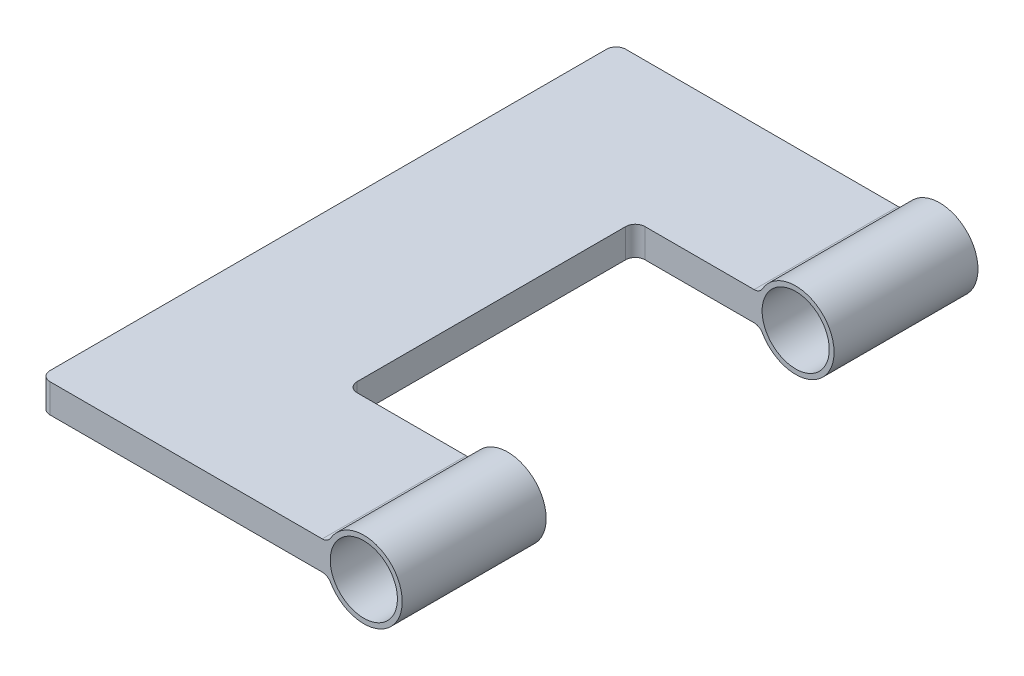
ISO-10303-21;
HEADER;
FILE_DESCRIPTION(('STEP AP214'),'2;1');
FILE_NAME('part.step','',(''),(''),'','','');
FILE_SCHEMA(('AUTOMOTIVE_DESIGN { 1 0 10303 214 1 1 1 1 }'));
ENDSEC;
DATA;
#1=APPLICATION_CONTEXT('core data for automotive mechanical design processes');
#2=APPLICATION_PROTOCOL_DEFINITION('international standard','automotive_design',2000,#1);
#3=PRODUCT_CONTEXT('',#1,'mechanical');
#4=PRODUCT('Part','Part','',(#3));
#5=PRODUCT_RELATED_PRODUCT_CATEGORY('part','',(#4));
#6=PRODUCT_DEFINITION_FORMATION('','',#4);
#7=PRODUCT_DEFINITION_CONTEXT('part definition',#1,'design');
#8=PRODUCT_DEFINITION('design','',#6,#7);
#9=PRODUCT_DEFINITION_SHAPE('','',#8);
#10=(LENGTH_UNIT() NAMED_UNIT(*) SI_UNIT(.MILLI.,.METRE.));
#11=(NAMED_UNIT(*) PLANE_ANGLE_UNIT() SI_UNIT($,.RADIAN.));
#12=(NAMED_UNIT(*) SI_UNIT($,.STERADIAN.) SOLID_ANGLE_UNIT());
#13=UNCERTAINTY_MEASURE_WITH_UNIT(LENGTH_MEASURE(1.E-05),#10,'distance_accuracy_value','');
#14=(GEOMETRIC_REPRESENTATION_CONTEXT(3) GLOBAL_UNCERTAINTY_ASSIGNED_CONTEXT((#13)) GLOBAL_UNIT_ASSIGNED_CONTEXT((#10,
#11,#12)) REPRESENTATION_CONTEXT('',''));
#15=CARTESIAN_POINT('',(0.,0.,0.));
#16=DIRECTION('',(0.,0.,1.));
#17=DIRECTION('',(1.,0.,0.));
#18=AXIS2_PLACEMENT_3D('',#15,#16,#17);
#19=CARTESIAN_POINT('',(168.540496217739,7.5,150.));
#20=DIRECTION('',(0.,0.,-1.));
#21=DIRECTION('',(-1.,0.,0.));
#22=AXIS2_PLACEMENT_3D('',#19,#20,#21);
#23=CYLINDRICAL_SURFACE('',#22,20.);
#24=CARTESIAN_POINT('',(168.540496217739,7.5,-75.));
#25=DIRECTION('',(0.,0.,-1.));
#26=DIRECTION('',(-1.,0.,0.));
#27=AXIS2_PLACEMENT_3D('',#24,#25,#26);
#28=CIRCLE('',#27,20.);
#29=CARTESIAN_POINT('',(151.21998814205,17.5,-75.));
#30=VERTEX_POINT('',#29);
#31=CARTESIAN_POINT('',(151.21998814205,-2.49999999999999,-75.));
#32=VERTEX_POINT('',#31);
#33=EDGE_CURVE('E270',#30,#32,#28,.T.);
#34=ORIENTED_EDGE('',*,*,#33,.T.);
#35=DIRECTION('',(0.,0.,-1.));
#36=VECTOR('',#35,1.);
#37=CARTESIAN_POINT('',(151.21998814205,-2.5,150.));
#38=LINE('',#37,#36);
#39=CARTESIAN_POINT('',(151.21998814205,-2.49999999999999,-150.));
#40=VERTEX_POINT('',#39);
#41=EDGE_CURVE('E205',#32,#40,#38,.T.);
#42=ORIENTED_EDGE('',*,*,#41,.T.);
#43=CARTESIAN_POINT('',(168.540496217739,7.5,-150.));
#44=DIRECTION('',(0.,0.,1.));
#45=DIRECTION('',(1.,0.,0.));
#46=AXIS2_PLACEMENT_3D('',#43,#44,#45);
#47=CIRCLE('',#46,20.);
#48=CARTESIAN_POINT('',(151.21998814205,17.5,-150.));
#49=VERTEX_POINT('',#48);
#50=EDGE_CURVE('E268',#40,#49,#47,.T.);
#51=ORIENTED_EDGE('',*,*,#50,.T.);
#52=DIRECTION('',(0.,0.,-1.));
#53=VECTOR('',#52,1.);
#54=CARTESIAN_POINT('',(151.21998814205,17.5,150.));
#55=LINE('',#54,#53);
#56=EDGE_CURVE('E203',#49,#30,#55,.F.);
#57=ORIENTED_EDGE('',*,*,#56,.T.);
#58=EDGE_LOOP('',(#34,#42,#51,#57));
#59=FACE_BOUND('',#58,.T.);
#60=ADVANCED_FACE('F36',(#59),#23,.T.);
#61=CARTESIAN_POINT('',(0.,0.,150.));
#62=DIRECTION('',(1.,0.,0.));
#63=DIRECTION('',(0.,0.,-1.));
#64=AXIS2_PLACEMENT_3D('',#61,#62,#63);
#65=PLANE('',#64);
#66=DIRECTION('',(0.,0.,-1.));
#67=VECTOR('',#66,1.);
#68=CARTESIAN_POINT('',(0.,15.,150.));
#69=LINE('',#68,#67);
#70=CARTESIAN_POINT('',(0.,15.,145.));
#71=VERTEX_POINT('',#70);
#72=CARTESIAN_POINT('',(0.,15.,-145.));
#73=VERTEX_POINT('',#72);
#74=EDGE_CURVE('E173',#71,#73,#69,.T.);
#75=ORIENTED_EDGE('',*,*,#74,.T.);
#76=DIRECTION('',(0.,-1.,0.));
#77=VECTOR('',#76,1.);
#78=CARTESIAN_POINT('',(0.,0.,-145.));
#79=LINE('',#78,#77);
#80=CARTESIAN_POINT('',(0.,0.,-145.));
#81=VERTEX_POINT('',#80);
#82=EDGE_CURVE('E171',#73,#81,#79,.T.);
#83=ORIENTED_EDGE('',*,*,#82,.T.);
#84=DIRECTION('',(0.,0.,-1.));
#85=VECTOR('',#84,1.);
#86=CARTESIAN_POINT('',(0.,0.,150.));
#87=LINE('',#86,#85);
#88=CARTESIAN_POINT('',(0.,0.,145.));
#89=VERTEX_POINT('',#88);
#90=EDGE_CURVE('E154',#89,#81,#87,.T.);
#91=ORIENTED_EDGE('',*,*,#90,.F.);
#92=DIRECTION('',(0.,-1.,0.));
#93=VECTOR('',#92,1.);
#94=CARTESIAN_POINT('',(0.,15.,145.));
#95=LINE('',#94,#93);
#96=EDGE_CURVE('E168',#89,#71,#95,.F.);
#97=ORIENTED_EDGE('',*,*,#96,.T.);
#98=EDGE_LOOP('',(#75,#83,#91,#97));
#99=FACE_BOUND('',#98,.T.);
#100=ADVANCED_FACE('F167',(#99),#65,.F.);
#101=CARTESIAN_POINT('',(0.,0.,150.));
#102=DIRECTION('',(0.,1.,0.));
#103=DIRECTION('',(0.,0.,1.));
#104=AXIS2_PLACEMENT_3D('',#101,#102,#103);
#105=PLANE('',#104);
#106=ORIENTED_EDGE('',*,*,#90,.T.);
#107=CARTESIAN_POINT('',(5.,0.,-145.));
#108=DIRECTION('',(0.,1.,0.));
#109=DIRECTION('',(0.,0.,1.));
#110=AXIS2_PLACEMENT_3D('',#107,#108,#109);
#111=CIRCLE('',#110,5.);
#112=CARTESIAN_POINT('',(5.,0.,-150.));
#113=VERTEX_POINT('',#112);
#114=EDGE_CURVE('E161',#81,#113,#111,.F.);
#115=ORIENTED_EDGE('',*,*,#114,.T.);
#116=DIRECTION('',(1.,0.,0.));
#117=VECTOR('',#116,1.);
#118=CARTESIAN_POINT('',(0.,0.,-150.));
#119=LINE('',#118,#117);
#120=CARTESIAN_POINT('',(146.889861123128,0.,-150.));
#121=VERTEX_POINT('',#120);
#122=EDGE_CURVE('E265',#113,#121,#119,.T.);
#123=ORIENTED_EDGE('',*,*,#122,.T.);
#124=DIRECTION('',(0.,0.,1.));
#125=VECTOR('',#124,1.);
#126=CARTESIAN_POINT('',(146.889861123128,0.,-75.));
#127=LINE('',#126,#125);
#128=CARTESIAN_POINT('',(146.889861123128,0.,-75.));
#129=VERTEX_POINT('',#128);
#130=EDGE_CURVE('E162',#121,#129,#127,.T.);
#131=ORIENTED_EDGE('',*,*,#130,.T.);
#132=DIRECTION('',(-1.,0.,0.));
#133=VECTOR('',#132,1.);
#134=CARTESIAN_POINT('',(0.,0.,-75.));
#135=LINE('',#134,#133);
#136=CARTESIAN_POINT('',(90.,0.,-75.));
#137=VERTEX_POINT('',#136);
#138=EDGE_CURVE('E261',#129,#137,#135,.T.);
#139=ORIENTED_EDGE('',*,*,#138,.T.);
#140=CARTESIAN_POINT('',(90.,0.,-70.));
#141=DIRECTION('',(0.,1.,0.));
#142=DIRECTION('',(0.,0.,1.));
#143=AXIS2_PLACEMENT_3D('',#140,#141,#142);
#144=CIRCLE('',#143,5.);
#145=CARTESIAN_POINT('',(85.,0.,-70.));
#146=VERTEX_POINT('',#145);
#147=EDGE_CURVE('E11',#137,#146,#144,.T.);
#148=ORIENTED_EDGE('',*,*,#147,.T.);
#149=DIRECTION('',(0.,0.,1.));
#150=VECTOR('',#149,1.);
#151=CARTESIAN_POINT('',(85.,0.,150.));
#152=LINE('',#151,#150);
#153=CARTESIAN_POINT('',(85.,0.,70.));
#154=VERTEX_POINT('',#153);
#155=EDGE_CURVE('E259',#146,#154,#152,.T.);
#156=ORIENTED_EDGE('',*,*,#155,.T.);
#157=CARTESIAN_POINT('',(90.,0.,70.));
#158=DIRECTION('',(0.,1.,0.));
#159=DIRECTION('',(0.,0.,1.));
#160=AXIS2_PLACEMENT_3D('',#157,#158,#159);
#161=CIRCLE('',#160,5.);
#162=CARTESIAN_POINT('',(90.,0.,75.));
#163=VERTEX_POINT('',#162);
#164=EDGE_CURVE('E238',#154,#163,#161,.T.);
#165=ORIENTED_EDGE('',*,*,#164,.T.);
#166=DIRECTION('',(1.,0.,0.));
#167=VECTOR('',#166,1.);
#168=CARTESIAN_POINT('',(0.,0.,75.));
#169=LINE('',#168,#167);
#170=CARTESIAN_POINT('',(146.889861123128,0.,75.));
#171=VERTEX_POINT('',#170);
#172=EDGE_CURVE('E293',#163,#171,#169,.T.);
#173=ORIENTED_EDGE('',*,*,#172,.T.);
#174=DIRECTION('',(0.,0.,1.));
#175=VECTOR('',#174,1.);
#176=CARTESIAN_POINT('',(146.889861123128,0.,150.));
#177=LINE('',#176,#175);
#178=CARTESIAN_POINT('',(146.889861123128,0.,150.));
#179=VERTEX_POINT('',#178);
#180=EDGE_CURVE('E180',#171,#179,#177,.T.);
#181=ORIENTED_EDGE('',*,*,#180,.T.);
#182=DIRECTION('',(1.,0.,0.));
#183=VECTOR('',#182,1.);
#184=CARTESIAN_POINT('',(0.,0.,150.));
#185=LINE('',#184,#183);
#186=CARTESIAN_POINT('',(5.,0.,150.));
#187=VERTEX_POINT('',#186);
#188=EDGE_CURVE('E156',#187,#179,#185,.T.);
#189=ORIENTED_EDGE('',*,*,#188,.F.);
#190=CARTESIAN_POINT('',(5.,0.,145.));
#191=DIRECTION('',(0.,1.,0.));
#192=DIRECTION('',(0.,0.,1.));
#193=AXIS2_PLACEMENT_3D('',#190,#191,#192);
#194=CIRCLE('',#193,5.);
#195=EDGE_CURVE('E151',#187,#89,#194,.F.);
#196=ORIENTED_EDGE('',*,*,#195,.T.);
#197=EDGE_LOOP('',(#106,#115,#123,#131,#139,#148,#156,#165,#173,#181,#189,#196));
#198=FACE_BOUND('',#197,.T.);
#199=ADVANCED_FACE('F153',(#198),#105,.F.);
#200=CARTESIAN_POINT('',(168.540496217739,7.5,150.));
#201=DIRECTION('',(0.,0.,1.));
#202=DIRECTION('',(1.,0.,0.));
#203=AXIS2_PLACEMENT_3D('',#200,#201,#202);
#204=CIRCLE('',#203,20.);
#205=CARTESIAN_POINT('',(151.21998814205,-2.49999999999999,150.));
#206=VERTEX_POINT('',#205);
#207=CARTESIAN_POINT('',(151.21998814205,17.5,150.));
#208=VERTEX_POINT('',#207);
#209=EDGE_CURVE('E275',#206,#208,#204,.T.);
#210=ORIENTED_EDGE('',*,*,#209,.F.);
#211=DIRECTION('',(0.,0.,-1.));
#212=VECTOR('',#211,1.);
#213=CARTESIAN_POINT('',(151.21998814205,-2.5,150.));
#214=LINE('',#213,#212);
#215=CARTESIAN_POINT('',(151.21998814205,-2.49999999999999,75.));
#216=VERTEX_POINT('',#215);
#217=EDGE_CURVE('E210',#206,#216,#214,.T.);
#218=ORIENTED_EDGE('',*,*,#217,.T.);
#219=CARTESIAN_POINT('',(168.540496217739,7.5,75.));
#220=DIRECTION('',(0.,0.,1.));
#221=DIRECTION('',(1.,0.,0.));
#222=AXIS2_PLACEMENT_3D('',#219,#220,#221);
#223=CIRCLE('',#222,20.);
#224=CARTESIAN_POINT('',(151.21998814205,17.5,75.));
#225=VERTEX_POINT('',#224);
#226=EDGE_CURVE('E296',#216,#225,#223,.T.);
#227=ORIENTED_EDGE('',*,*,#226,.T.);
#228=DIRECTION('',(0.,0.,-1.));
#229=VECTOR('',#228,1.);
#230=CARTESIAN_POINT('',(151.21998814205,17.5,150.));
#231=LINE('',#230,#229);
#232=EDGE_CURVE('E208',#225,#208,#231,.F.);
#233=ORIENTED_EDGE('',*,*,#232,.T.);
#234=EDGE_LOOP('',(#210,#218,#227,#233));
#235=FACE_BOUND('',#234,.T.);
#236=ADVANCED_FACE('F305',(#235),#23,.T.);
#237=CARTESIAN_POINT('',(0.,15.,150.));
#238=DIRECTION('',(0.,-1.,0.));
#239=DIRECTION('',(0.,0.,-1.));
#240=AXIS2_PLACEMENT_3D('',#237,#238,#239);
#241=PLANE('',#240);
#242=DIRECTION('',(-1.,0.,0.));
#243=VECTOR('',#242,1.);
#244=CARTESIAN_POINT('',(0.,15.,-150.));
#245=LINE('',#244,#243);
#246=CARTESIAN_POINT('',(146.889861123128,15.,-150.));
#247=VERTEX_POINT('',#246);
#248=CARTESIAN_POINT('',(5.,15.,-150.));
#249=VERTEX_POINT('',#248);
#250=EDGE_CURVE('E276',#247,#249,#245,.T.);
#251=ORIENTED_EDGE('',*,*,#250,.T.);
#252=CARTESIAN_POINT('',(5.,15.,-145.));
#253=DIRECTION('',(0.,-1.,0.));
#254=DIRECTION('',(0.,0.,-1.));
#255=AXIS2_PLACEMENT_3D('',#252,#253,#254);
#256=CIRCLE('',#255,5.);
#257=EDGE_CURVE('E199',#249,#73,#256,.F.);
#258=ORIENTED_EDGE('',*,*,#257,.T.);
#259=ORIENTED_EDGE('',*,*,#74,.F.);
#260=CARTESIAN_POINT('',(5.,15.,145.));
#261=DIRECTION('',(0.,-1.,0.));
#262=DIRECTION('',(0.,0.,-1.));
#263=AXIS2_PLACEMENT_3D('',#260,#261,#262);
#264=CIRCLE('',#263,5.);
#265=CARTESIAN_POINT('',(5.,15.,150.));
#266=VERTEX_POINT('',#265);
#267=EDGE_CURVE('E177',#71,#266,#264,.F.);
#268=ORIENTED_EDGE('',*,*,#267,.T.);
#269=DIRECTION('',(-1.,0.,0.));
#270=VECTOR('',#269,1.);
#271=CARTESIAN_POINT('',(0.,15.,150.));
#272=LINE('',#271,#270);
#273=CARTESIAN_POINT('',(146.889861123128,15.,150.));
#274=VERTEX_POINT('',#273);
#275=EDGE_CURVE('E279',#274,#266,#272,.T.);
#276=ORIENTED_EDGE('',*,*,#275,.F.);
#277=DIRECTION('',(0.,0.,1.));
#278=VECTOR('',#277,1.);
#279=CARTESIAN_POINT('',(146.889861123128,15.,75.));
#280=LINE('',#279,#278);
#281=CARTESIAN_POINT('',(146.889861123128,15.,75.));
#282=VERTEX_POINT('',#281);
#283=EDGE_CURVE('E195',#274,#282,#280,.F.);
#284=ORIENTED_EDGE('',*,*,#283,.T.);
#285=DIRECTION('',(-1.,0.,0.));
#286=VECTOR('',#285,1.);
#287=CARTESIAN_POINT('',(0.,15.,75.));
#288=LINE('',#287,#286);
#289=CARTESIAN_POINT('',(90.,15.,75.));
#290=VERTEX_POINT('',#289);
#291=EDGE_CURVE('E172',#282,#290,#288,.T.);
#292=ORIENTED_EDGE('',*,*,#291,.T.);
#293=CARTESIAN_POINT('',(90.,15.,70.));
#294=DIRECTION('',(0.,-1.,0.));
#295=DIRECTION('',(0.,0.,-1.));
#296=AXIS2_PLACEMENT_3D('',#293,#294,#295);
#297=CIRCLE('',#296,5.);
#298=CARTESIAN_POINT('',(85.,15.,70.));
#299=VERTEX_POINT('',#298);
#300=EDGE_CURVE('E236',#290,#299,#297,.T.);
#301=ORIENTED_EDGE('',*,*,#300,.T.);
#302=DIRECTION('',(0.,0.,-1.));
#303=VECTOR('',#302,1.);
#304=CARTESIAN_POINT('',(85.,15.,150.));
#305=LINE('',#304,#303);
#306=CARTESIAN_POINT('',(85.,15.,-70.));
#307=VERTEX_POINT('',#306);
#308=EDGE_CURVE('E183',#299,#307,#305,.T.);
#309=ORIENTED_EDGE('',*,*,#308,.T.);
#310=CARTESIAN_POINT('',(90.,15.,-70.));
#311=DIRECTION('',(0.,-1.,0.));
#312=DIRECTION('',(0.,0.,-1.));
#313=AXIS2_PLACEMENT_3D('',#310,#311,#312);
#314=CIRCLE('',#313,5.);
#315=CARTESIAN_POINT('',(90.,15.,-75.));
#316=VERTEX_POINT('',#315);
#317=EDGE_CURVE('E45',#307,#316,#314,.T.);
#318=ORIENTED_EDGE('',*,*,#317,.T.);
#319=DIRECTION('',(1.,0.,0.));
#320=VECTOR('',#319,1.);
#321=CARTESIAN_POINT('',(0.,15.,-75.));
#322=LINE('',#321,#320);
#323=CARTESIAN_POINT('',(146.889861123128,15.,-75.));
#324=VERTEX_POINT('',#323);
#325=EDGE_CURVE('E178',#316,#324,#322,.T.);
#326=ORIENTED_EDGE('',*,*,#325,.T.);
#327=DIRECTION('',(0.,0.,1.));
#328=VECTOR('',#327,1.);
#329=CARTESIAN_POINT('',(146.889861123128,15.,-150.));
#330=LINE('',#329,#328);
#331=EDGE_CURVE('E192',#324,#247,#330,.F.);
#332=ORIENTED_EDGE('',*,*,#331,.T.);
#333=EDGE_LOOP('',(#251,#258,#259,#268,#276,#284,#292,#301,#309,#318,#326,#332));
#334=FACE_BOUND('',#333,.T.);
#335=ADVANCED_FACE('F244',(#334),#241,.F.);
#336=CARTESIAN_POINT('',(168.540496217739,7.5,150.));
#337=DIRECTION('',(0.,0.,1.));
#338=DIRECTION('',(1.,0.,0.));
#339=AXIS2_PLACEMENT_3D('',#336,#337,#338);
#340=PLANE('',#339);
#341=CARTESIAN_POINT('',(168.540496217739,7.5,150.));
#342=DIRECTION('',(0.,0.,1.));
#343=DIRECTION('',(1.,0.,0.));
#344=AXIS2_PLACEMENT_3D('',#341,#342,#343);
#345=CIRCLE('',#344,17.5);
#346=CARTESIAN_POINT('',(186.040496217739,7.5,150.));
#347=VERTEX_POINT('',#346);
#348=EDGE_CURVE('E328',#347,#347,#345,.T.);
#349=ORIENTED_EDGE('',*,*,#348,.F.);
#350=EDGE_LOOP('',(#349));
#351=FACE_BOUND('',#350,.T.);
#352=ORIENTED_EDGE('',*,*,#275,.T.);
#353=DIRECTION('',(0.,-1.,0.));
#354=VECTOR('',#353,1.);
#355=CARTESIAN_POINT('',(5.,0.,150.));
#356=LINE('',#355,#354);
#357=EDGE_CURVE('E201',#266,#187,#356,.T.);
#358=ORIENTED_EDGE('',*,*,#357,.T.);
#359=ORIENTED_EDGE('',*,*,#188,.T.);
#360=CARTESIAN_POINT('',(146.889861123128,-5.,150.));
#361=DIRECTION('',(0.,0.,1.));
#362=DIRECTION('',(1.,0.,0.));
#363=AXIS2_PLACEMENT_3D('',#360,#361,#362);
#364=CIRCLE('',#363,5.);
#365=EDGE_CURVE('E227',#179,#206,#364,.F.);
#366=ORIENTED_EDGE('',*,*,#365,.T.);
#367=ORIENTED_EDGE('',*,*,#209,.T.);
#368=CARTESIAN_POINT('',(146.889861123128,20.,150.));
#369=DIRECTION('',(0.,0.,1.));
#370=DIRECTION('',(1.,0.,0.));
#371=AXIS2_PLACEMENT_3D('',#368,#369,#370);
#372=CIRCLE('',#371,5.);
#373=EDGE_CURVE('E230',#208,#274,#372,.F.);
#374=ORIENTED_EDGE('',*,*,#373,.T.);
#375=EDGE_LOOP('',(#352,#358,#359,#366,#367,#374));
#376=FACE_BOUND('',#375,.T.);
#377=ADVANCED_FACE('F302',(#351,#376),#340,.T.);
#378=CARTESIAN_POINT('',(168.540496217739,7.5,-150.));
#379=DIRECTION('',(0.,0.,1.));
#380=DIRECTION('',(1.,0.,0.));
#381=AXIS2_PLACEMENT_3D('',#378,#379,#380);
#382=PLANE('',#381);
#383=CARTESIAN_POINT('',(168.540496217739,7.5,-150.));
#384=DIRECTION('',(0.,0.,1.));
#385=DIRECTION('',(1.,0.,0.));
#386=AXIS2_PLACEMENT_3D('',#383,#384,#385);
#387=CIRCLE('',#386,17.5);
#388=CARTESIAN_POINT('',(186.040496217739,7.5,-150.));
#389=VERTEX_POINT('',#388);
#390=EDGE_CURVE('E331',#389,#389,#387,.T.);
#391=ORIENTED_EDGE('',*,*,#390,.T.);
#392=EDGE_LOOP('',(#391));
#393=FACE_BOUND('',#392,.T.);
#394=ORIENTED_EDGE('',*,*,#122,.F.);
#395=DIRECTION('',(0.,-1.,0.));
#396=VECTOR('',#395,1.);
#397=CARTESIAN_POINT('',(5.,7.5,-150.));
#398=LINE('',#397,#396);
#399=EDGE_CURVE('E190',#113,#249,#398,.F.);
#400=ORIENTED_EDGE('',*,*,#399,.T.);
#401=ORIENTED_EDGE('',*,*,#250,.F.);
#402=CARTESIAN_POINT('',(146.889861123128,20.,-150.));
#403=DIRECTION('',(0.,0.,1.));
#404=DIRECTION('',(1.,0.,0.));
#405=AXIS2_PLACEMENT_3D('',#402,#403,#404);
#406=CIRCLE('',#405,5.);
#407=EDGE_CURVE('E232',#247,#49,#406,.T.);
#408=ORIENTED_EDGE('',*,*,#407,.T.);
#409=ORIENTED_EDGE('',*,*,#50,.F.);
#410=CARTESIAN_POINT('',(146.889861123128,-5.,-150.));
#411=DIRECTION('',(0.,0.,1.));
#412=DIRECTION('',(1.,0.,0.));
#413=AXIS2_PLACEMENT_3D('',#410,#411,#412);
#414=CIRCLE('',#413,5.);
#415=EDGE_CURVE('E222',#40,#121,#414,.T.);
#416=ORIENTED_EDGE('',*,*,#415,.T.);
#417=EDGE_LOOP('',(#394,#400,#401,#408,#409,#416));
#418=FACE_BOUND('',#417,.T.);
#419=ADVANCED_FACE('F316',(#393,#418),#382,.F.);
#420=CARTESIAN_POINT('',(85.,-150.,75.));
#421=DIRECTION('',(-1.,0.,0.));
#422=DIRECTION('',(0.,0.,1.));
#423=AXIS2_PLACEMENT_3D('',#420,#421,#422);
#424=PLANE('',#423);
#425=ORIENTED_EDGE('',*,*,#308,.F.);
#426=DIRECTION('',(0.,1.,0.));
#427=VECTOR('',#426,1.);
#428=CARTESIAN_POINT('',(85.,0.,70.));
#429=LINE('',#428,#427);
#430=EDGE_CURVE('E218',#299,#154,#429,.F.);
#431=ORIENTED_EDGE('',*,*,#430,.T.);
#432=ORIENTED_EDGE('',*,*,#155,.F.);
#433=DIRECTION('',(0.,1.,0.));
#434=VECTOR('',#433,1.);
#435=CARTESIAN_POINT('',(85.,15.,-70.));
#436=LINE('',#435,#434);
#437=EDGE_CURVE('E215',#146,#307,#436,.T.);
#438=ORIENTED_EDGE('',*,*,#437,.T.);
#439=EDGE_LOOP('',(#425,#431,#432,#438));
#440=FACE_BOUND('',#439,.T.);
#441=ADVANCED_FACE('F263',(#440),#424,.F.);
#442=CARTESIAN_POINT('',(85.,-150.,-75.));
#443=DIRECTION('',(0.,0.,-1.));
#444=DIRECTION('',(-1.,0.,0.));
#445=AXIS2_PLACEMENT_3D('',#442,#443,#444);
#446=PLANE('',#445);
#447=CARTESIAN_POINT('',(168.540496217739,7.5,-75.));
#448=DIRECTION('',(0.,0.,-1.));
#449=DIRECTION('',(-1.,0.,0.));
#450=AXIS2_PLACEMENT_3D('',#447,#448,#449);
#451=CIRCLE('',#450,17.5);
#452=CARTESIAN_POINT('',(151.040496217739,7.5,-75.));
#453=VERTEX_POINT('',#452);
#454=EDGE_CURVE('E334',#453,#453,#451,.T.);
#455=ORIENTED_EDGE('',*,*,#454,.T.);
#456=EDGE_LOOP('',(#455));
#457=FACE_BOUND('',#456,.T.);
#458=ORIENTED_EDGE('',*,*,#325,.F.);
#459=DIRECTION('',(0.,1.,0.));
#460=VECTOR('',#459,1.);
#461=CARTESIAN_POINT('',(90.,0.,-75.));
#462=LINE('',#461,#460);
#463=EDGE_CURVE('E220',#316,#137,#462,.F.);
#464=ORIENTED_EDGE('',*,*,#463,.T.);
#465=ORIENTED_EDGE('',*,*,#138,.F.);
#466=CARTESIAN_POINT('',(146.889861123128,-5.,-75.));
#467=DIRECTION('',(0.,0.,-1.));
#468=DIRECTION('',(-1.,0.,0.));
#469=AXIS2_PLACEMENT_3D('',#466,#467,#468);
#470=CIRCLE('',#469,5.);
#471=EDGE_CURVE('E224',#129,#32,#470,.T.);
#472=ORIENTED_EDGE('',*,*,#471,.T.);
#473=ORIENTED_EDGE('',*,*,#33,.F.);
#474=CARTESIAN_POINT('',(146.889861123128,20.,-75.));
#475=DIRECTION('',(0.,0.,-1.));
#476=DIRECTION('',(-1.,0.,0.));
#477=AXIS2_PLACEMENT_3D('',#474,#475,#476);
#478=CIRCLE('',#477,5.);
#479=EDGE_CURVE('E234',#30,#324,#478,.T.);
#480=ORIENTED_EDGE('',*,*,#479,.T.);
#481=EDGE_LOOP('',(#458,#464,#465,#472,#473,#480));
#482=FACE_BOUND('',#481,.T.);
#483=ADVANCED_FACE('F251',(#457,#482),#446,.F.);
#484=CARTESIAN_POINT('',(85.,-150.,75.));
#485=DIRECTION('',(0.,0.,1.));
#486=DIRECTION('',(1.,0.,0.));
#487=AXIS2_PLACEMENT_3D('',#484,#485,#486);
#488=PLANE('',#487);
#489=CARTESIAN_POINT('',(168.540496217739,7.5,75.));
#490=DIRECTION('',(0.,0.,1.));
#491=DIRECTION('',(1.,0.,0.));
#492=AXIS2_PLACEMENT_3D('',#489,#490,#491);
#493=CIRCLE('',#492,17.5);
#494=CARTESIAN_POINT('',(186.040496217739,7.5,75.));
#495=VERTEX_POINT('',#494);
#496=EDGE_CURVE('E40',#495,#495,#493,.T.);
#497=ORIENTED_EDGE('',*,*,#496,.T.);
#498=EDGE_LOOP('',(#497));
#499=FACE_BOUND('',#498,.T.);
#500=ORIENTED_EDGE('',*,*,#172,.F.);
#501=DIRECTION('',(0.,1.,0.));
#502=VECTOR('',#501,1.);
#503=CARTESIAN_POINT('',(90.,15.,75.));
#504=LINE('',#503,#502);
#505=EDGE_CURVE('E212',#163,#290,#504,.T.);
#506=ORIENTED_EDGE('',*,*,#505,.T.);
#507=ORIENTED_EDGE('',*,*,#291,.F.);
#508=CARTESIAN_POINT('',(146.889861123128,20.,75.));
#509=DIRECTION('',(0.,0.,1.));
#510=DIRECTION('',(1.,0.,0.));
#511=AXIS2_PLACEMENT_3D('',#508,#509,#510);
#512=CIRCLE('',#511,5.);
#513=EDGE_CURVE('E52',#282,#225,#512,.T.);
#514=ORIENTED_EDGE('',*,*,#513,.T.);
#515=ORIENTED_EDGE('',*,*,#226,.F.);
#516=CARTESIAN_POINT('',(146.889861123128,-5.,75.));
#517=DIRECTION('',(0.,0.,1.));
#518=DIRECTION('',(1.,0.,0.));
#519=AXIS2_PLACEMENT_3D('',#516,#517,#518);
#520=CIRCLE('',#519,5.);
#521=EDGE_CURVE('E60',#216,#171,#520,.T.);
#522=ORIENTED_EDGE('',*,*,#521,.T.);
#523=EDGE_LOOP('',(#500,#506,#507,#514,#515,#522));
#524=FACE_BOUND('',#523,.T.);
#525=ADVANCED_FACE('F290',(#499,#524),#488,.F.);
#526=CARTESIAN_POINT('',(5.,0.,-145.));
#527=DIRECTION('',(0.,-1.,0.));
#528=DIRECTION('',(0.,0.,-1.));
#529=AXIS2_PLACEMENT_3D('',#526,#527,#528);
#530=CYLINDRICAL_SURFACE('',#529,5.);
#531=ORIENTED_EDGE('',*,*,#257,.F.);
#532=ORIENTED_EDGE('',*,*,#399,.F.);
#533=ORIENTED_EDGE('',*,*,#114,.F.);
#534=ORIENTED_EDGE('',*,*,#82,.F.);
#535=EDGE_LOOP('',(#531,#532,#533,#534));
#536=FACE_BOUND('',#535,.T.);
#537=ADVANCED_FACE('F311',(#536),#530,.T.);
#538=CARTESIAN_POINT('',(5.,7.5,145.));
#539=DIRECTION('',(0.,1.,0.));
#540=DIRECTION('',(0.,0.,1.));
#541=AXIS2_PLACEMENT_3D('',#538,#539,#540);
#542=CYLINDRICAL_SURFACE('',#541,5.);
#543=ORIENTED_EDGE('',*,*,#267,.F.);
#544=ORIENTED_EDGE('',*,*,#96,.F.);
#545=ORIENTED_EDGE('',*,*,#195,.F.);
#546=ORIENTED_EDGE('',*,*,#357,.F.);
#547=EDGE_LOOP('',(#543,#544,#545,#546));
#548=FACE_BOUND('',#547,.T.);
#549=ADVANCED_FACE('F176',(#548),#542,.T.);
#550=CARTESIAN_POINT('',(146.889861123128,-5.,150.));
#551=DIRECTION('',(0.,0.,-1.));
#552=DIRECTION('',(-1.,0.,0.));
#553=AXIS2_PLACEMENT_3D('',#550,#551,#552);
#554=CYLINDRICAL_SURFACE('',#553,5.);
#555=ORIENTED_EDGE('',*,*,#471,.F.);
#556=ORIENTED_EDGE('',*,*,#130,.F.);
#557=ORIENTED_EDGE('',*,*,#415,.F.);
#558=ORIENTED_EDGE('',*,*,#41,.F.);
#559=EDGE_LOOP('',(#555,#556,#557,#558));
#560=FACE_BOUND('',#559,.T.);
#561=ADVANCED_FACE('F322',(#560),#554,.F.);
#562=CARTESIAN_POINT('',(146.889861123128,-5.,150.));
#563=DIRECTION('',(0.,0.,-1.));
#564=DIRECTION('',(-1.,0.,0.));
#565=AXIS2_PLACEMENT_3D('',#562,#563,#564);
#566=CYLINDRICAL_SURFACE('',#565,5.);
#567=ORIENTED_EDGE('',*,*,#365,.F.);
#568=ORIENTED_EDGE('',*,*,#180,.F.);
#569=ORIENTED_EDGE('',*,*,#521,.F.);
#570=ORIENTED_EDGE('',*,*,#217,.F.);
#571=EDGE_LOOP('',(#567,#568,#569,#570));
#572=FACE_BOUND('',#571,.T.);
#573=ADVANCED_FACE('F299',(#572),#566,.F.);
#574=CARTESIAN_POINT('',(146.889861123128,20.,150.));
#575=DIRECTION('',(0.,0.,-1.));
#576=DIRECTION('',(-1.,0.,0.));
#577=AXIS2_PLACEMENT_3D('',#574,#575,#576);
#578=CYLINDRICAL_SURFACE('',#577,5.);
#579=ORIENTED_EDGE('',*,*,#373,.F.);
#580=ORIENTED_EDGE('',*,*,#232,.F.);
#581=ORIENTED_EDGE('',*,*,#513,.F.);
#582=ORIENTED_EDGE('',*,*,#283,.F.);
#583=EDGE_LOOP('',(#579,#580,#581,#582));
#584=FACE_BOUND('',#583,.T.);
#585=ADVANCED_FACE('F308',(#584),#578,.F.);
#586=CARTESIAN_POINT('',(146.889861123128,20.,150.));
#587=DIRECTION('',(0.,0.,-1.));
#588=DIRECTION('',(-1.,0.,0.));
#589=AXIS2_PLACEMENT_3D('',#586,#587,#588);
#590=CYLINDRICAL_SURFACE('',#589,5.);
#591=ORIENTED_EDGE('',*,*,#479,.F.);
#592=ORIENTED_EDGE('',*,*,#56,.F.);
#593=ORIENTED_EDGE('',*,*,#407,.F.);
#594=ORIENTED_EDGE('',*,*,#331,.F.);
#595=EDGE_LOOP('',(#591,#592,#593,#594));
#596=FACE_BOUND('',#595,.T.);
#597=ADVANCED_FACE('F379',(#596),#590,.F.);
#598=CARTESIAN_POINT('',(90.,-150.,70.));
#599=DIRECTION('',(0.,-1.,0.));
#600=DIRECTION('',(0.,0.,-1.));
#601=AXIS2_PLACEMENT_3D('',#598,#599,#600);
#602=CYLINDRICAL_SURFACE('',#601,5.);
#603=ORIENTED_EDGE('',*,*,#164,.F.);
#604=ORIENTED_EDGE('',*,*,#430,.F.);
#605=ORIENTED_EDGE('',*,*,#300,.F.);
#606=ORIENTED_EDGE('',*,*,#505,.F.);
#607=EDGE_LOOP('',(#603,#604,#605,#606));
#608=FACE_BOUND('',#607,.T.);
#609=ADVANCED_FACE('F295',(#608),#602,.F.);
#610=CARTESIAN_POINT('',(90.,-150.,-70.));
#611=DIRECTION('',(0.,-1.,0.));
#612=DIRECTION('',(0.,0.,-1.));
#613=AXIS2_PLACEMENT_3D('',#610,#611,#612);
#614=CYLINDRICAL_SURFACE('',#613,5.);
#615=ORIENTED_EDGE('',*,*,#147,.F.);
#616=ORIENTED_EDGE('',*,*,#463,.F.);
#617=ORIENTED_EDGE('',*,*,#317,.F.);
#618=ORIENTED_EDGE('',*,*,#437,.F.);
#619=EDGE_LOOP('',(#615,#616,#617,#618));
#620=FACE_BOUND('',#619,.T.);
#621=ADVANCED_FACE('F38',(#620),#614,.F.);
#622=CARTESIAN_POINT('',(168.540496217739,7.5,-228.));
#623=DIRECTION('',(0.,0.,1.));
#624=DIRECTION('',(1.,0.,0.));
#625=AXIS2_PLACEMENT_3D('',#622,#623,#624);
#626=CYLINDRICAL_SURFACE('',#625,17.5);
#627=ORIENTED_EDGE('',*,*,#348,.T.);
#628=EDGE_LOOP('',(#627));
#629=FACE_BOUND('',#628,.T.);
#630=ORIENTED_EDGE('',*,*,#496,.F.);
#631=EDGE_LOOP('',(#630));
#632=FACE_BOUND('',#631,.T.);
#633=ADVANCED_FACE('F342',(#629,#632),#626,.F.);
#634=ORIENTED_EDGE('',*,*,#454,.F.);
#635=EDGE_LOOP('',(#634));
#636=FACE_BOUND('',#635,.T.);
#637=ORIENTED_EDGE('',*,*,#390,.F.);
#638=EDGE_LOOP('',(#637));
#639=FACE_BOUND('',#638,.T.);
#640=ADVANCED_FACE('F344',(#636,#639),#626,.F.);
#641=CLOSED_SHELL('',(#60,#100,#199,#236,#335,#377,#419,#441,#483,#525,#537,#549,#561,#573,#585,
#597,#609,#621,#633,#640));
#642=MANIFOLD_SOLID_BREP('B2',#641);
#643=ADVANCED_BREP_SHAPE_REPRESENTATION('',(#18,#642),#14);
#644=SHAPE_DEFINITION_REPRESENTATION(#9,#643);
ENDSEC;
END-ISO-10303-21;
